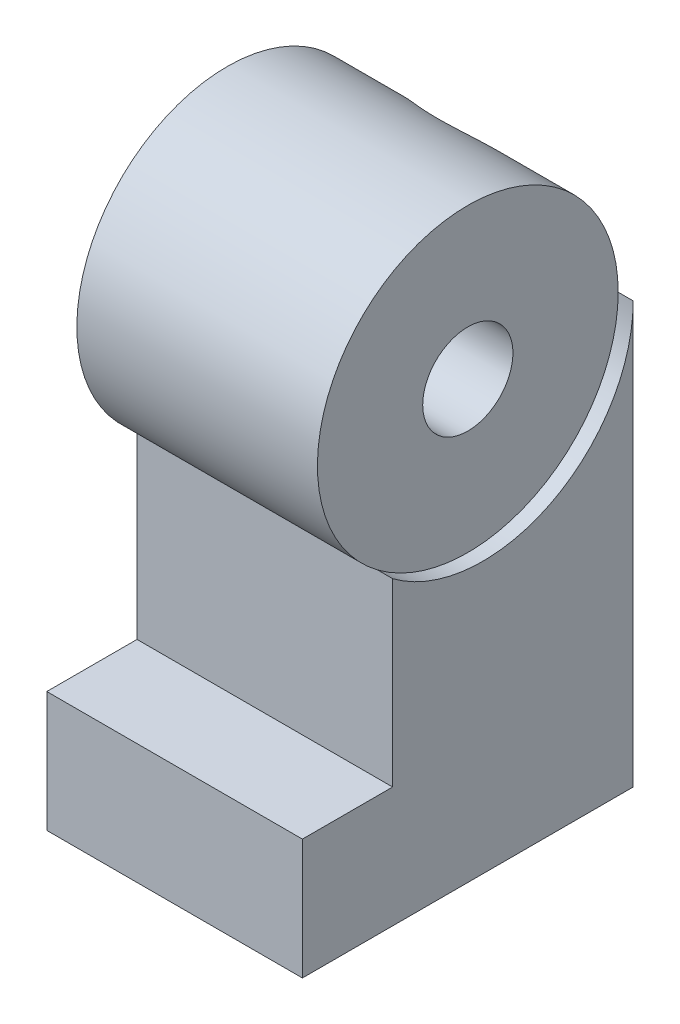
ISO-10303-21;
HEADER;
FILE_DESCRIPTION(('STEP AP214'),'2;1');
FILE_NAME('part.step','',(''),(''),'','','');
FILE_SCHEMA(('AUTOMOTIVE_DESIGN { 1 0 10303 214 1 1 1 1 }'));
ENDSEC;
DATA;
#1=APPLICATION_CONTEXT('core data for automotive mechanical design processes');
#2=APPLICATION_PROTOCOL_DEFINITION('international standard','automotive_design',2000,#1);
#3=PRODUCT_CONTEXT('',#1,'mechanical');
#4=PRODUCT('Part','Part','',(#3));
#5=PRODUCT_RELATED_PRODUCT_CATEGORY('part','',(#4));
#6=PRODUCT_DEFINITION_FORMATION('','',#4);
#7=PRODUCT_DEFINITION_CONTEXT('part definition',#1,'design');
#8=PRODUCT_DEFINITION('design','',#6,#7);
#9=PRODUCT_DEFINITION_SHAPE('','',#8);
#10=(LENGTH_UNIT() NAMED_UNIT(*) SI_UNIT(.MILLI.,.METRE.));
#11=(NAMED_UNIT(*) PLANE_ANGLE_UNIT() SI_UNIT($,.RADIAN.));
#12=(NAMED_UNIT(*) SI_UNIT($,.STERADIAN.) SOLID_ANGLE_UNIT());
#13=UNCERTAINTY_MEASURE_WITH_UNIT(LENGTH_MEASURE(1.E-05),#10,'distance_accuracy_value','');
#14=(GEOMETRIC_REPRESENTATION_CONTEXT(3) GLOBAL_UNCERTAINTY_ASSIGNED_CONTEXT((#13)) GLOBAL_UNIT_ASSIGNED_CONTEXT((#10,
#11,#12)) REPRESENTATION_CONTEXT('',''));
#15=CARTESIAN_POINT('',(0.,0.,0.));
#16=DIRECTION('',(0.,0.,1.));
#17=DIRECTION('',(1.,0.,0.));
#18=AXIS2_PLACEMENT_3D('',#15,#16,#17);
#19=CARTESIAN_POINT('',(6.746875,0.,4.365625));
#20=DIRECTION('',(0.,1.,0.));
#21=DIRECTION('',(0.,0.,1.));
#22=AXIS2_PLACEMENT_3D('',#19,#20,#21);
#23=PLANE('',#22);
#24=DIRECTION('',(-1.,0.,0.));
#25=VECTOR('',#24,1.);
#26=CARTESIAN_POINT('',(6.746875,0.,-4.365625));
#27=LINE('',#26,#25);
#28=CARTESIAN_POINT('',(0.,0.,-4.365625));
#29=VERTEX_POINT('',#28);
#30=CARTESIAN_POINT('',(-6.746875,0.,-4.365625));
#31=VERTEX_POINT('',#30);
#32=EDGE_CURVE('E174',#29,#31,#27,.T.);
#33=ORIENTED_EDGE('',*,*,#32,.F.);
#34=DIRECTION('',(0.,0.,-1.));
#35=VECTOR('',#34,1.);
#36=CARTESIAN_POINT('',(0.,0.,4.365625));
#37=LINE('',#36,#35);
#38=CARTESIAN_POINT('',(0.,0.,4.365625));
#39=VERTEX_POINT('',#38);
#40=EDGE_CURVE('E162',#39,#29,#37,.T.);
#41=ORIENTED_EDGE('',*,*,#40,.F.);
#42=DIRECTION('',(-1.,0.,0.));
#43=VECTOR('',#42,1.);
#44=CARTESIAN_POINT('',(6.746875,0.,4.365625));
#45=LINE('',#44,#43);
#46=CARTESIAN_POINT('',(-6.746875,0.,4.365625));
#47=VERTEX_POINT('',#46);
#48=EDGE_CURVE('E49',#39,#47,#45,.T.);
#49=ORIENTED_EDGE('',*,*,#48,.T.);
#50=DIRECTION('',(0.,0.,-1.));
#51=VECTOR('',#50,1.);
#52=CARTESIAN_POINT('',(-6.746875,0.,4.365625));
#53=LINE('',#52,#51);
#54=EDGE_CURVE('E220',#47,#31,#53,.T.);
#55=ORIENTED_EDGE('',*,*,#54,.T.);
#56=EDGE_LOOP('',(#33,#41,#49,#55));
#57=FACE_BOUND('',#56,.T.);
#58=DIRECTION('',(-1.,0.,0.));
#59=VECTOR('',#58,1.);
#60=CARTESIAN_POINT('',(-5.953125,0.,2.38125));
#61=LINE('',#60,#59);
#62=CARTESIAN_POINT('',(-1.190625,0.,2.38125));
#63=VERTEX_POINT('',#62);
#64=CARTESIAN_POINT('',(-5.953125,0.,2.38125));
#65=VERTEX_POINT('',#64);
#66=EDGE_CURVE('E282',#63,#65,#61,.T.);
#67=ORIENTED_EDGE('',*,*,#66,.F.);
#68=DIRECTION('',(0.,0.,1.));
#69=VECTOR('',#68,1.);
#70=CARTESIAN_POINT('',(-1.190625,0.,2.38125));
#71=LINE('',#70,#69);
#72=CARTESIAN_POINT('',(-1.190625,0.,-2.38125));
#73=VERTEX_POINT('',#72);
#74=EDGE_CURVE('E278',#73,#63,#71,.T.);
#75=ORIENTED_EDGE('',*,*,#74,.F.);
#76=DIRECTION('',(1.,0.,0.));
#77=VECTOR('',#76,1.);
#78=CARTESIAN_POINT('',(-1.190625,0.,-2.38125));
#79=LINE('',#78,#77);
#80=CARTESIAN_POINT('',(-5.953125,0.,-2.38125));
#81=VERTEX_POINT('',#80);
#82=EDGE_CURVE('E239',#81,#73,#79,.T.);
#83=ORIENTED_EDGE('',*,*,#82,.F.);
#84=DIRECTION('',(0.,0.,-1.));
#85=VECTOR('',#84,1.);
#86=CARTESIAN_POINT('',(-5.953125,0.,0.));
#87=LINE('',#86,#85);
#88=EDGE_CURVE('E234',#65,#81,#87,.T.);
#89=ORIENTED_EDGE('',*,*,#88,.F.);
#90=EDGE_LOOP('',(#67,#75,#83,#89));
#91=FACE_BOUND('',#90,.T.);
#92=ADVANCED_FACE('F41',(#57,#91),#23,.F.);
#93=CARTESIAN_POINT('',(6.746875,0.,4.365625));
#94=DIRECTION('',(0.,0.,-1.));
#95=DIRECTION('',(-1.,0.,0.));
#96=AXIS2_PLACEMENT_3D('',#93,#94,#95);
#97=PLANE('',#96);
#98=ORIENTED_EDGE('',*,*,#48,.F.);
#99=DIRECTION('',(0.,-1.,0.));
#100=VECTOR('',#99,1.);
#101=CARTESIAN_POINT('',(0.,0.,4.365625));
#102=LINE('',#101,#100);
#103=CARTESIAN_POINT('',(0.,3.175,4.365625));
#104=VERTEX_POINT('',#103);
#105=EDGE_CURVE('E159',#104,#39,#102,.T.);
#106=ORIENTED_EDGE('',*,*,#105,.F.);
#107=DIRECTION('',(-1.,0.,0.));
#108=VECTOR('',#107,1.);
#109=CARTESIAN_POINT('',(6.746875,3.175,4.365625));
#110=LINE('',#109,#108);
#111=CARTESIAN_POINT('',(-6.746875,3.175,4.365625));
#112=VERTEX_POINT('',#111);
#113=EDGE_CURVE('E191',#104,#112,#110,.T.);
#114=ORIENTED_EDGE('',*,*,#113,.T.);
#115=DIRECTION('',(0.,-1.,0.));
#116=VECTOR('',#115,1.);
#117=CARTESIAN_POINT('',(-6.746875,0.,4.365625));
#118=LINE('',#117,#116);
#119=EDGE_CURVE('E178',#112,#47,#118,.T.);
#120=ORIENTED_EDGE('',*,*,#119,.T.);
#121=EDGE_LOOP('',(#98,#106,#114,#120));
#122=FACE_BOUND('',#121,.T.);
#123=ADVANCED_FACE('F43',(#122),#97,.F.);
#124=CARTESIAN_POINT('',(6.746875,11.1125,-4.365625));
#125=DIRECTION('',(0.,0.,1.));
#126=DIRECTION('',(0.,-1.,0.));
#127=AXIS2_PLACEMENT_3D('',#124,#125,#126);
#128=PLANE('',#127);
#129=DIRECTION('',(-1.,0.,0.));
#130=VECTOR('',#129,1.);
#131=CARTESIAN_POINT('',(6.746875,11.1125,-4.365625));
#132=LINE('',#131,#130);
#133=CARTESIAN_POINT('',(0.,11.1125,-4.365625));
#134=VERTEX_POINT('',#133);
#135=CARTESIAN_POINT('',(-0.396874999999998,11.1125,-4.365625));
#136=VERTEX_POINT('',#135);
#137=EDGE_CURVE('E183',#134,#136,#132,.T.);
#138=ORIENTED_EDGE('',*,*,#137,.F.);
#139=DIRECTION('',(0.,-1.,0.));
#140=VECTOR('',#139,1.);
#141=CARTESIAN_POINT('',(0.,11.1125,-4.365625));
#142=LINE('',#141,#140);
#143=EDGE_CURVE('E56',#134,#29,#142,.T.);
#144=ORIENTED_EDGE('',*,*,#143,.T.);
#145=ORIENTED_EDGE('',*,*,#32,.T.);
#146=DIRECTION('',(0.,1.,0.));
#147=VECTOR('',#146,1.);
#148=CARTESIAN_POINT('',(-6.746875,11.1125,-4.365625));
#149=LINE('',#148,#147);
#150=CARTESIAN_POINT('',(-6.746875,11.1125,-4.365625));
#151=VERTEX_POINT('',#150);
#152=EDGE_CURVE('E217',#31,#151,#149,.T.);
#153=ORIENTED_EDGE('',*,*,#152,.T.);
#154=DIRECTION('',(1.,0.,0.));
#155=VECTOR('',#154,1.);
#156=CARTESIAN_POINT('',(-6.746875,11.1125,-4.365625));
#157=LINE('',#156,#155);
#158=CARTESIAN_POINT('',(-5.81693903026729,11.1125,-4.365625));
#159=VERTEX_POINT('',#158);
#160=EDGE_CURVE('E204',#151,#159,#157,.T.);
#161=ORIENTED_EDGE('',*,*,#160,.T.);
#162=CARTESIAN_POINT('',(-3.571875,11.90625,-4.365625));
#163=DIRECTION('',(0.,0.,1.));
#164=DIRECTION('',(0.,1.,0.));
#165=AXIS2_PLACEMENT_3D('',#162,#163,#164);
#166=CIRCLE('',#165,2.38125000000001);
#167=CARTESIAN_POINT('',(-1.32681096973271,11.1125,-4.365625));
#168=VERTEX_POINT('',#167);
#169=EDGE_CURVE('E656',#159,#168,#166,.T.);
#170=ORIENTED_EDGE('',*,*,#169,.T.);
#171=EDGE_CURVE('E208',#168,#136,#157,.T.);
#172=ORIENTED_EDGE('',*,*,#171,.T.);
#173=EDGE_LOOP('',(#138,#144,#145,#153,#161,#170,#172));
#174=FACE_BOUND('',#173,.T.);
#175=CARTESIAN_POINT('',(-3.571875,3.96875,-4.365625));
#176=DIRECTION('',(0.,0.,1.));
#177=DIRECTION('',(0.,1.,0.));
#178=AXIS2_PLACEMENT_3D('',#175,#176,#177);
#179=CIRCLE('',#178,2.38125);
#180=CARTESIAN_POINT('',(-3.571875,6.35,-4.365625));
#181=VERTEX_POINT('',#180);
#182=EDGE_CURVE('E659',#181,#181,#179,.T.);
#183=ORIENTED_EDGE('',*,*,#182,.T.);
#184=EDGE_LOOP('',(#183));
#185=FACE_BOUND('',#184,.T.);
#186=ADVANCED_FACE('F349',(#174,#185),#128,.F.);
#187=CARTESIAN_POINT('',(6.746875,3.175,1.984375));
#188=DIRECTION('',(0.,0.,-1.));
#189=DIRECTION('',(-1.,0.,0.));
#190=AXIS2_PLACEMENT_3D('',#187,#188,#189);
#191=PLANE('',#190);
#192=DIRECTION('',(-1.,0.,0.));
#193=VECTOR('',#192,1.);
#194=CARTESIAN_POINT('',(6.746875,3.175,1.984375));
#195=LINE('',#194,#193);
#196=CARTESIAN_POINT('',(0.,3.175,1.984375));
#197=VERTEX_POINT('',#196);
#198=CARTESIAN_POINT('',(-6.746875,3.175,1.984375));
#199=VERTEX_POINT('',#198);
#200=EDGE_CURVE('E188',#197,#199,#195,.T.);
#201=ORIENTED_EDGE('',*,*,#200,.F.);
#202=DIRECTION('',(0.,1.,0.));
#203=VECTOR('',#202,1.);
#204=CARTESIAN_POINT('',(0.,3.175,1.984375));
#205=LINE('',#204,#203);
#206=CARTESIAN_POINT('',(0.,7.9375,1.984375));
#207=VERTEX_POINT('',#206);
#208=EDGE_CURVE('E175',#197,#207,#205,.T.);
#209=ORIENTED_EDGE('',*,*,#208,.T.);
#210=DIRECTION('',(1.,0.,0.));
#211=VECTOR('',#210,1.);
#212=CARTESIAN_POINT('',(-11.2253201513364,7.9375,1.984375));
#213=LINE('',#212,#211);
#214=CARTESIAN_POINT('',(-0.396875,7.9375,1.984375));
#215=VERTEX_POINT('',#214);
#216=EDGE_CURVE('E194',#207,#215,#213,.F.);
#217=ORIENTED_EDGE('',*,*,#216,.T.);
#218=DIRECTION('',(-1.,0.,0.));
#219=VECTOR('',#218,1.);
#220=CARTESIAN_POINT('',(11.2253201513364,7.9375,1.984375));
#221=LINE('',#220,#219);
#222=CARTESIAN_POINT('',(-6.746875,7.9375,1.984375));
#223=VERTEX_POINT('',#222);
#224=EDGE_CURVE('E225',#223,#215,#221,.F.);
#225=ORIENTED_EDGE('',*,*,#224,.F.);
#226=DIRECTION('',(0.,-1.,0.));
#227=VECTOR('',#226,1.);
#228=CARTESIAN_POINT('',(-6.746875,3.175,1.984375));
#229=LINE('',#228,#227);
#230=EDGE_CURVE('E213',#223,#199,#229,.T.);
#231=ORIENTED_EDGE('',*,*,#230,.T.);
#232=EDGE_LOOP('',(#201,#209,#217,#225,#231));
#233=FACE_BOUND('',#232,.T.);
#234=ADVANCED_FACE('F345',(#233),#191,.F.);
#235=CARTESIAN_POINT('',(6.746875,3.175,4.365625));
#236=DIRECTION('',(0.,-1.,0.));
#237=DIRECTION('',(0.,0.,-1.));
#238=AXIS2_PLACEMENT_3D('',#235,#236,#237);
#239=PLANE('',#238);
#240=ORIENTED_EDGE('',*,*,#113,.F.);
#241=DIRECTION('',(0.,0.,-1.));
#242=VECTOR('',#241,1.);
#243=CARTESIAN_POINT('',(0.,3.175,4.365625));
#244=LINE('',#243,#242);
#245=EDGE_CURVE('E164',#104,#197,#244,.T.);
#246=ORIENTED_EDGE('',*,*,#245,.T.);
#247=ORIENTED_EDGE('',*,*,#200,.T.);
#248=DIRECTION('',(0.,0.,1.));
#249=VECTOR('',#248,1.);
#250=CARTESIAN_POINT('',(-6.746875,3.175,4.365625));
#251=LINE('',#250,#249);
#252=EDGE_CURVE('E209',#199,#112,#251,.T.);
#253=ORIENTED_EDGE('',*,*,#252,.T.);
#254=EDGE_LOOP('',(#240,#246,#247,#253));
#255=FACE_BOUND('',#254,.T.);
#256=ADVANCED_FACE('F341',(#255),#239,.F.);
#257=CARTESIAN_POINT('',(17.9721951513364,11.1125,-0.396874999999999));
#258=DIRECTION('',(-1.,0.,0.));
#259=DIRECTION('',(0.,0.,1.));
#260=AXIS2_PLACEMENT_3D('',#257,#258,#259);
#261=CYLINDRICAL_SURFACE('',#260,3.96875);
#262=ORIENTED_EDGE('',*,*,#216,.F.);
#263=CARTESIAN_POINT('',(0.,11.1125,-0.396874999999999));
#264=DIRECTION('',(-1.,0.,0.));
#265=DIRECTION('',(0.,0.,1.));
#266=AXIS2_PLACEMENT_3D('',#263,#264,#265);
#267=CIRCLE('',#266,3.96875);
#268=EDGE_CURVE('E12',#207,#134,#267,.F.);
#269=ORIENTED_EDGE('',*,*,#268,.T.);
#270=ORIENTED_EDGE('',*,*,#137,.T.);
#271=CARTESIAN_POINT('',(-0.396874999999998,11.1125,-0.396874999999999));
#272=DIRECTION('',(-1.,0.,0.));
#273=DIRECTION('',(0.,0.,1.));
#274=AXIS2_PLACEMENT_3D('',#271,#272,#273);
#275=CIRCLE('',#274,3.96875);
#276=EDGE_CURVE('E255',#215,#136,#275,.F.);
#277=ORIENTED_EDGE('',*,*,#276,.F.);
#278=EDGE_LOOP('',(#262,#269,#270,#277));
#279=FACE_BOUND('',#278,.T.);
#280=ADVANCED_FACE('F337',(#279),#261,.F.);
#281=CARTESIAN_POINT('',(-1.190625,15.08325,-2.38125));
#282=DIRECTION('',(0.,0.,1.));
#283=DIRECTION('',(0.,-1.,0.));
#284=AXIS2_PLACEMENT_3D('',#281,#282,#283);
#285=PLANE('',#284);
#286=DIRECTION('',(0.,1.,0.));
#287=VECTOR('',#286,1.);
#288=CARTESIAN_POINT('',(-2.778125,9.66118596973271,-2.38125));
#289=LINE('',#288,#287);
#290=CARTESIAN_POINT('',(-2.778125,9.66118596973271,-2.38125));
#291=VERTEX_POINT('',#290);
#292=CARTESIAN_POINT('',(-2.778125,14.1513140302673,-2.38125));
#293=VERTEX_POINT('',#292);
#294=EDGE_CURVE('E640',#291,#293,#289,.T.);
#295=ORIENTED_EDGE('',*,*,#294,.T.);
#296=CARTESIAN_POINT('',(-3.571875,11.90625,-2.38125));
#297=DIRECTION('',(0.,0.,-1.));
#298=DIRECTION('',(0.,-1.,0.));
#299=AXIS2_PLACEMENT_3D('',#296,#297,#298);
#300=CIRCLE('',#299,2.38125000000001);
#301=EDGE_CURVE('E317',#291,#293,#300,.F.);
#302=ORIENTED_EDGE('',*,*,#301,.F.);
#303=EDGE_LOOP('',(#295,#302));
#304=FACE_BOUND('',#303,.T.);
#305=ADVANCED_FACE('F340',(#304),#285,.F.);
#306=CARTESIAN_POINT('',(-1.190625,15.08325,-2.38125));
#307=DIRECTION('',(0.,0.,1.));
#308=DIRECTION('',(0.,-1.,0.));
#309=AXIS2_PLACEMENT_3D('',#306,#307,#308);
#310=PLANE('',#309);
#311=CARTESIAN_POINT('',(-3.571875,3.96875,-2.38125));
#312=DIRECTION('',(0.,0.,-1.));
#313=DIRECTION('',(0.,-1.,0.));
#314=AXIS2_PLACEMENT_3D('',#311,#312,#313);
#315=CIRCLE('',#314,2.38125);
#316=CARTESIAN_POINT('',(-1.190625,3.96875,-2.38125));
#317=VERTEX_POINT('',#316);
#318=CARTESIAN_POINT('',(-5.953125,3.96875,-2.38125));
#319=VERTEX_POINT('',#318);
#320=EDGE_CURVE('E316',#317,#319,#315,.F.);
#321=ORIENTED_EDGE('',*,*,#320,.F.);
#322=DIRECTION('',(0.,-1.,0.));
#323=VECTOR('',#322,1.);
#324=CARTESIAN_POINT('',(-1.190625,15.08325,-2.38125));
#325=LINE('',#324,#323);
#326=CARTESIAN_POINT('',(-1.190625,7.67546167873051,-2.38125));
#327=VERTEX_POINT('',#326);
#328=EDGE_CURVE('E267',#327,#317,#325,.T.);
#329=ORIENTED_EDGE('',*,*,#328,.F.);
#330=DIRECTION('',(-1.,0.,0.));
#331=VECTOR('',#330,1.);
#332=CARTESIAN_POINT('',(10.8284451513364,7.67546167873051,-2.38125));
#333=LINE('',#332,#331);
#334=CARTESIAN_POINT('',(-5.953125,7.67546167873051,-2.38125));
#335=VERTEX_POINT('',#334);
#336=EDGE_CURVE('E302',#327,#335,#333,.T.);
#337=ORIENTED_EDGE('',*,*,#336,.T.);
#338=DIRECTION('',(0.,-1.,0.));
#339=VECTOR('',#338,1.);
#340=CARTESIAN_POINT('',(-5.953125,15.08325,-2.38125));
#341=LINE('',#340,#339);
#342=EDGE_CURVE('E274',#335,#319,#341,.T.);
#343=ORIENTED_EDGE('',*,*,#342,.T.);
#344=EDGE_LOOP('',(#321,#329,#337,#343));
#345=FACE_BOUND('',#344,.T.);
#346=ADVANCED_FACE('F329',(#345),#310,.T.);
#347=CARTESIAN_POINT('',(11.2253201513364,11.1125,-0.396874999999999));
#348=DIRECTION('',(-1.,0.,0.));
#349=DIRECTION('',(0.,0.,-1.));
#350=AXIS2_PLACEMENT_3D('',#347,#348,#349);
#351=CYLINDRICAL_SURFACE('',#350,3.96875);
#352=CARTESIAN_POINT('',(-1.32681096973271,11.1125,-4.365625));
#353=CARTESIAN_POINT('',(-1.30701755525374,11.1684542487782,-4.36563495142378));
#354=CARTESIAN_POINT('',(-1.28933418573402,11.2251567426196,-4.36444187589844));
#355=CARTESIAN_POINT('',(-1.25826719656662,11.339615668586,-4.35953264570903));
#356=CARTESIAN_POINT('',(-1.2448832691343,11.3973720249551,-4.3558166717113));
#357=CARTESIAN_POINT('',(-1.22253803103019,11.5132653525563,-4.34576537472123));
#358=CARTESIAN_POINT('',(-1.21355875029495,11.5713997800275,-4.33944089181621));
#359=CARTESIAN_POINT('',(-1.19994008150046,11.68780993877,-4.32414497095028));
#360=CARTESIAN_POINT('',(-1.19530050429691,11.7460856637718,-4.31517364837326));
#361=CARTESIAN_POINT('',(-1.18783402252553,11.9205011039694,-4.28428932674348));
#362=CARTESIAN_POINT('',(-1.19144682230573,12.0362954200456,-4.25840032621934));
#363=CARTESIAN_POINT('',(-1.21480133281904,12.2635264169128,-4.19687828490391));
#364=CARTESIAN_POINT('',(-1.23455316803175,12.3749603162937,-4.1612391369035));
#365=CARTESIAN_POINT('',(-1.28945780546674,12.594878206545,-4.08031480120449));
#366=CARTESIAN_POINT('',(-1.32512164870348,12.7031253464996,-4.03473759885851));
#367=CARTESIAN_POINT('',(-1.40995842608976,12.910772929603,-3.93670525741914));
#368=CARTESIAN_POINT('',(-1.45913444185718,13.0101713478367,-3.884248550798));
#369=CARTESIAN_POINT('',(-1.57850828121833,13.2151339018736,-3.76528729185824));
#370=CARTESIAN_POINT('',(-1.65084913136497,13.3189326446407,-3.69790269036965));
#371=CARTESIAN_POINT('',(-1.8097757049671,13.5128380361569,-3.55971381274583));
#372=CARTESIAN_POINT('',(-1.89639328803208,13.6029131743021,-3.48890214433307));
#373=CARTESIAN_POINT('',(-2.04503270465009,13.7350768823537,-3.37635143782159));
#374=CARTESIAN_POINT('',(-2.1028373332676,13.7818412968881,-3.33443489445976));
#375=CARTESIAN_POINT('',(-2.22314076494899,13.8701336363607,-3.25171092436964));
#376=CARTESIAN_POINT('',(-2.28564167761434,13.911659185256,-3.2109040074379));
#377=CARTESIAN_POINT('',(-2.41522685178416,13.98908449684,-3.13170532815867));
#378=CARTESIAN_POINT('',(-2.48229935284518,14.0249979664163,-3.09330782298671));
#379=CARTESIAN_POINT('',(-2.62123402300634,14.0908637875129,-3.02037206915601));
#380=CARTESIAN_POINT('',(-2.69309124281277,14.1208221748982,-2.98582992857089));
#381=CARTESIAN_POINT('',(-2.8475670512362,14.1762671053601,-2.9200281156823));
#382=CARTESIAN_POINT('',(-2.93058753935312,14.2012168561875,-2.88924005750429));
#383=CARTESIAN_POINT('',(-3.10166067161263,14.2422625358819,-2.83750297370962));
#384=CARTESIAN_POINT('',(-3.18970215569316,14.2583773156041,-2.8165330136554));
#385=CARTESIAN_POINT('',(-3.37018005290364,14.2806970263171,-2.78724525807482));
#386=CARTESIAN_POINT('',(-3.46265288221283,14.2867962238212,-2.77906249883042));
#387=CARTESIAN_POINT('',(-3.64782240088153,14.2880875326372,-2.77734248857693));
#388=CARTESIAN_POINT('',(-3.74051907887779,14.283280186437,-2.78380450914133));
#389=CARTESIAN_POINT('',(-3.9119398229629,14.2644843582118,-2.80854588253211));
#390=CARTESIAN_POINT('',(-3.99102190241361,14.2516462481256,-2.82534073482566));
#391=CARTESIAN_POINT('',(-4.14536649071659,14.2187583541195,-2.86726909307836));
#392=CARTESIAN_POINT('',(-4.22062549115162,14.1987020778502,-2.89241010437086));
#393=CARTESIAN_POINT('',(-4.41491912867954,14.1369086837694,-2.96739228283316));
#394=CARTESIAN_POINT('',(-4.53009220373622,14.089596197385,-3.02258860505556));
#395=CARTESIAN_POINT('',(-4.7484218209142,13.9801551686941,-3.14170959287202));
#396=CARTESIAN_POINT('',(-4.85153633106603,13.9179769750056,-3.20566319517299));
#397=CARTESIAN_POINT('',(-5.01113575176531,13.8048570233376,-3.3133696473234));
#398=CARTESIAN_POINT('',(-5.07110844847499,13.7578494344151,-3.35616718956509));
#399=CARTESIAN_POINT('',(-5.18615961786883,13.6584557082274,-3.44210253914183));
#400=CARTESIAN_POINT('',(-5.24123664209993,13.6060679889914,-3.48524044309471));
#401=CARTESIAN_POINT('',(-5.3987969941357,13.4411122764214,-3.61368535655438));
#402=CARTESIAN_POINT('',(-5.49387346962105,13.3205644315129,-3.69820896743568));
#403=CARTESIAN_POINT('',(-5.64558468177028,13.0835635829583,-3.84384143135618));
#404=CARTESIAN_POINT('',(-5.70607404999784,12.9704414438622,-3.90639638612007));
#405=CARTESIAN_POINT('',(-5.809146855791,12.7319391129767,-4.02259929427164));
#406=CARTESIAN_POINT('',(-5.85174641472338,12.6065700835947,-4.0762552404816));
#407=CARTESIAN_POINT('',(-5.9000444298798,12.4108054268426,-4.14791656174465));
#408=CARTESIAN_POINT('',(-5.91357250663917,12.3438963897962,-4.17042700331695));
#409=CARTESIAN_POINT('',(-5.93490653945093,12.2081513519553,-4.21204852034721));
#410=CARTESIAN_POINT('',(-5.9427157240873,12.1393164612206,-4.23116150920455));
#411=CARTESIAN_POINT('',(-5.9522831482818,12.0003538391527,-4.26570110143064));
#412=CARTESIAN_POINT('',(-5.95404522641276,11.9302269563855,-4.28113003756639));
#413=CARTESIAN_POINT('',(-5.9512989945741,11.7893928936788,-4.30813263003261));
#414=CARTESIAN_POINT('',(-5.94679319797398,11.7186859576363,-4.31970782937556));
#415=CARTESIAN_POINT('',(-5.92919483451744,11.5574140038843,-4.34166513075442));
#416=CARTESIAN_POINT('',(-5.91403523758213,11.4668847895153,-4.35078531060102));
#417=CARTESIAN_POINT('',(-5.88345670776998,11.3326119670545,-4.35977224461627));
#418=CARTESIAN_POINT('',(-5.87194857599804,11.2880830053145,-4.36198558791466));
#419=CARTESIAN_POINT('',(-5.84636132242703,11.1997253376775,-4.36491246473769));
#420=CARTESIAN_POINT('',(-5.83228251038636,11.1558965481034,-4.36562617883319));
#421=CARTESIAN_POINT('',(-5.81693903026729,11.1125,-4.365625));
#422=B_SPLINE_CURVE_WITH_KNOTS('',3,(#352,#353,#354,#355,#356,#357,#358,#359,#360,#361,#362,
#363,#364,#365,#366,#367,#368,#369,#370,#371,#372,#373,#374,#375,#376,#377,#378,#379,#380,#381,
#382,#383,#384,#385,#386,#387,#388,#389,#390,#391,#392,#393,#394,#395,#396,#397,#398,#399,#400,
#401,#402,#403,#404,#405,#406,#407,#408,#409,#410,#411,#412,#413,#414,#415,#416,#417,#418,#419,
#420,#421),.UNSPECIFIED.,.F.,.F.,(4,2,2,2,2,2,2,2,2,2,2,2,2,2,2,2,2,2,2,2,2,2,2,2,2,2,2,2,2,2,2,
2,2,2,4),(0.,0.178003936551981,0.355995127474543,0.533253982525169,0.710505111457348,
1.06480679321033,1.4193309093656,1.78616738421233,2.15308759018841,2.58159393935689,
3.01106981153157,3.2668813061563,3.52280840797637,3.77810032248523,4.03313214757179,
4.30821568372511,4.58270997704483,4.86008387357856,5.13744397392907,5.38207395783397,
5.62692452531978,6.03324709638796,6.44094622281295,6.70283852114437,6.96480804783826,
7.48764136400289,7.91423378942165,8.3404409626894,8.55579968810129,8.77103673944507,
8.98613713765132,9.20115130711372,9.47693752858245,9.614987519328,9.75302088647394),.UNSPECIFIED.);
#423=EDGE_CURVE('E306',#168,#159,#422,.T.);
#424=ORIENTED_EDGE('',*,*,#423,.T.);
#425=ORIENTED_EDGE('',*,*,#160,.F.);
#426=CARTESIAN_POINT('',(-6.746875,11.1125,-0.396874999999999));
#427=DIRECTION('',(1.,0.,0.));
#428=DIRECTION('',(0.,0.,-1.));
#429=AXIS2_PLACEMENT_3D('',#426,#427,#428);
#430=CIRCLE('',#429,3.96875);
#431=EDGE_CURVE('E229',#151,#223,#430,.T.);
#432=ORIENTED_EDGE('',*,*,#431,.T.);
#433=ORIENTED_EDGE('',*,*,#224,.T.);
#434=CARTESIAN_POINT('',(-0.396875,11.1125,-0.396874999999999));
#435=DIRECTION('',(-1.,0.,0.));
#436=DIRECTION('',(0.,0.,1.));
#437=AXIS2_PLACEMENT_3D('',#434,#435,#436);
#438=CIRCLE('',#437,3.96875);
#439=EDGE_CURVE('E200',#136,#215,#438,.F.);
#440=ORIENTED_EDGE('',*,*,#439,.F.);
#441=ORIENTED_EDGE('',*,*,#171,.F.);
#442=EDGE_LOOP('',(#424,#425,#432,#433,#440,#441));
#443=FACE_BOUND('',#442,.T.);
#444=ADVANCED_FACE('F323',(#443),#351,.T.);
#445=CARTESIAN_POINT('',(-6.746875,0.,0.));
#446=DIRECTION('',(1.,0.,0.));
#447=DIRECTION('',(0.,0.,1.));
#448=AXIS2_PLACEMENT_3D('',#445,#446,#447);
#449=PLANE('',#448);
#450=ORIENTED_EDGE('',*,*,#152,.F.);
#451=ORIENTED_EDGE('',*,*,#54,.F.);
#452=ORIENTED_EDGE('',*,*,#119,.F.);
#453=ORIENTED_EDGE('',*,*,#252,.F.);
#454=ORIENTED_EDGE('',*,*,#230,.F.);
#455=ORIENTED_EDGE('',*,*,#431,.F.);
#456=EDGE_LOOP('',(#450,#451,#452,#453,#454,#455));
#457=FACE_BOUND('',#456,.T.);
#458=ADVANCED_FACE('F328',(#457),#449,.F.);
#459=CARTESIAN_POINT('',(-6.746875,3.175,1.190625));
#460=DIRECTION('',(0.,0.,-1.));
#461=DIRECTION('',(1.,0.,0.));
#462=AXIS2_PLACEMENT_3D('',#459,#460,#461);
#463=PLANE('',#462);
#464=DIRECTION('',(-1.,0.,0.));
#465=VECTOR('',#464,1.);
#466=CARTESIAN_POINT('',(10.8284451513364,7.4750805421288,1.190625));
#467=LINE('',#466,#465);
#468=CARTESIAN_POINT('',(-5.953125,7.4750805421288,1.190625));
#469=VERTEX_POINT('',#468);
#470=CARTESIAN_POINT('',(-1.190625,7.4750805421288,1.190625));
#471=VERTEX_POINT('',#470);
#472=EDGE_CURVE('E292',#469,#471,#467,.F.);
#473=ORIENTED_EDGE('',*,*,#472,.T.);
#474=DIRECTION('',(0.,1.,0.));
#475=VECTOR('',#474,1.);
#476=CARTESIAN_POINT('',(-1.190625,15.08325,1.190625));
#477=LINE('',#476,#475);
#478=CARTESIAN_POINT('',(-1.190625,2.38125,1.190625));
#479=VERTEX_POINT('',#478);
#480=EDGE_CURVE('E254',#479,#471,#477,.T.);
#481=ORIENTED_EDGE('',*,*,#480,.F.);
#482=DIRECTION('',(1.,0.,0.));
#483=VECTOR('',#482,1.);
#484=CARTESIAN_POINT('',(-6.746875,2.38125,1.190625));
#485=LINE('',#484,#483);
#486=CARTESIAN_POINT('',(-5.953125,2.38125,1.190625));
#487=VERTEX_POINT('',#486);
#488=EDGE_CURVE('E233',#487,#479,#485,.T.);
#489=ORIENTED_EDGE('',*,*,#488,.F.);
#490=DIRECTION('',(0.,-1.,0.));
#491=VECTOR('',#490,1.);
#492=CARTESIAN_POINT('',(-5.953125,0.,1.190625));
#493=LINE('',#492,#491);
#494=EDGE_CURVE('E238',#469,#487,#493,.T.);
#495=ORIENTED_EDGE('',*,*,#494,.F.);
#496=EDGE_LOOP('',(#473,#481,#489,#495));
#497=FACE_BOUND('',#496,.T.);
#498=ADVANCED_FACE('F335',(#497),#463,.T.);
#499=CARTESIAN_POINT('',(-6.746875,2.38125,4.365625));
#500=DIRECTION('',(0.,-1.,0.));
#501=DIRECTION('',(0.,0.,-1.));
#502=AXIS2_PLACEMENT_3D('',#499,#500,#501);
#503=PLANE('',#502);
#504=DIRECTION('',(1.,0.,0.));
#505=VECTOR('',#504,1.);
#506=CARTESIAN_POINT('',(-5.953125,2.38125,2.38125));
#507=LINE('',#506,#505);
#508=CARTESIAN_POINT('',(-5.953125,2.38125,2.38125));
#509=VERTEX_POINT('',#508);
#510=CARTESIAN_POINT('',(-1.190625,2.38125,2.38125));
#511=VERTEX_POINT('',#510);
#512=EDGE_CURVE('E250',#509,#511,#507,.T.);
#513=ORIENTED_EDGE('',*,*,#512,.F.);
#514=DIRECTION('',(0.,0.,1.));
#515=VECTOR('',#514,1.);
#516=CARTESIAN_POINT('',(-5.953125,2.38125,0.));
#517=LINE('',#516,#515);
#518=EDGE_CURVE('E243',#487,#509,#517,.T.);
#519=ORIENTED_EDGE('',*,*,#518,.F.);
#520=ORIENTED_EDGE('',*,*,#488,.T.);
#521=DIRECTION('',(0.,0.,-1.));
#522=VECTOR('',#521,1.);
#523=CARTESIAN_POINT('',(-1.190625,2.38125,2.38125));
#524=LINE('',#523,#522);
#525=EDGE_CURVE('E259',#511,#479,#524,.T.);
#526=ORIENTED_EDGE('',*,*,#525,.F.);
#527=EDGE_LOOP('',(#513,#519,#520,#526));
#528=FACE_BOUND('',#527,.T.);
#529=ADVANCED_FACE('F404',(#528),#503,.T.);
#530=CARTESIAN_POINT('',(-5.953125,0.,0.));
#531=DIRECTION('',(1.,0.,0.));
#532=DIRECTION('',(0.,0.,1.));
#533=AXIS2_PLACEMENT_3D('',#530,#531,#532);
#534=PLANE('',#533);
#535=CARTESIAN_POINT('',(-5.953125,11.1125,-0.396874999999999));
#536=DIRECTION('',(-1.,0.,0.));
#537=DIRECTION('',(0.,0.,1.));
#538=AXIS2_PLACEMENT_3D('',#535,#536,#537);
#539=CIRCLE('',#538,3.96875);
#540=EDGE_CURVE('E296',#335,#469,#539,.T.);
#541=ORIENTED_EDGE('',*,*,#540,.T.);
#542=ORIENTED_EDGE('',*,*,#494,.T.);
#543=ORIENTED_EDGE('',*,*,#518,.T.);
#544=DIRECTION('',(0.,-1.,0.));
#545=VECTOR('',#544,1.);
#546=CARTESIAN_POINT('',(-5.953125,15.08325,2.38125));
#547=LINE('',#546,#545);
#548=EDGE_CURVE('E266',#509,#65,#547,.T.);
#549=ORIENTED_EDGE('',*,*,#548,.T.);
#550=ORIENTED_EDGE('',*,*,#88,.T.);
#551=EDGE_CURVE('E270',#319,#81,#341,.T.);
#552=ORIENTED_EDGE('',*,*,#551,.F.);
#553=ORIENTED_EDGE('',*,*,#342,.F.);
#554=EDGE_LOOP('',(#541,#542,#543,#549,#550,#552,#553));
#555=FACE_BOUND('',#554,.T.);
#556=ADVANCED_FACE('F331',(#555),#534,.T.);
#557=CARTESIAN_POINT('',(-5.953125,15.08325,2.38125));
#558=DIRECTION('',(0.,0.,-1.));
#559=DIRECTION('',(0.,1.,0.));
#560=AXIS2_PLACEMENT_3D('',#557,#558,#559);
#561=PLANE('',#560);
#562=ORIENTED_EDGE('',*,*,#512,.T.);
#563=DIRECTION('',(0.,-1.,0.));
#564=VECTOR('',#563,1.);
#565=CARTESIAN_POINT('',(-1.190625,15.08325,2.38125));
#566=LINE('',#565,#564);
#567=EDGE_CURVE('E263',#511,#63,#566,.T.);
#568=ORIENTED_EDGE('',*,*,#567,.T.);
#569=ORIENTED_EDGE('',*,*,#66,.T.);
#570=ORIENTED_EDGE('',*,*,#548,.F.);
#571=EDGE_LOOP('',(#562,#568,#569,#570));
#572=FACE_BOUND('',#571,.T.);
#573=ADVANCED_FACE('F418',(#572),#561,.T.);
#574=CARTESIAN_POINT('',(-1.190625,15.08325,2.38125));
#575=DIRECTION('',(-1.,0.,0.));
#576=DIRECTION('',(0.,0.,-1.));
#577=AXIS2_PLACEMENT_3D('',#574,#575,#576);
#578=PLANE('',#577);
#579=CARTESIAN_POINT('',(-1.190625,11.1125,-0.396874999999999));
#580=DIRECTION('',(1.,0.,0.));
#581=DIRECTION('',(0.,0.,-1.));
#582=AXIS2_PLACEMENT_3D('',#579,#580,#581);
#583=CIRCLE('',#582,3.96875);
#584=EDGE_CURVE('E299',#471,#327,#583,.T.);
#585=ORIENTED_EDGE('',*,*,#584,.T.);
#586=ORIENTED_EDGE('',*,*,#328,.T.);
#587=EDGE_CURVE('E262',#317,#73,#325,.T.);
#588=ORIENTED_EDGE('',*,*,#587,.T.);
#589=ORIENTED_EDGE('',*,*,#74,.T.);
#590=ORIENTED_EDGE('',*,*,#567,.F.);
#591=ORIENTED_EDGE('',*,*,#525,.T.);
#592=ORIENTED_EDGE('',*,*,#480,.T.);
#593=EDGE_LOOP('',(#585,#586,#588,#589,#590,#591,#592));
#594=FACE_BOUND('',#593,.T.);
#595=ADVANCED_FACE('F425',(#594),#578,.T.);
#596=CARTESIAN_POINT('',(-3.571875,3.96875,-2.38125));
#597=DIRECTION('',(0.,0.,-1.));
#598=DIRECTION('',(0.,-1.,0.));
#599=AXIS2_PLACEMENT_3D('',#596,#597,#598);
#600=CIRCLE('',#599,2.38125);
#601=EDGE_CURVE('E197',#317,#319,#600,.T.);
#602=ORIENTED_EDGE('',*,*,#601,.T.);
#603=ORIENTED_EDGE('',*,*,#551,.T.);
#604=ORIENTED_EDGE('',*,*,#82,.T.);
#605=ORIENTED_EDGE('',*,*,#587,.F.);
#606=EDGE_LOOP('',(#602,#603,#604,#605));
#607=FACE_BOUND('',#606,.T.);
#608=ADVANCED_FACE('F389',(#607),#310,.T.);
#609=CARTESIAN_POINT('',(-0.396875,0.,0.));
#610=DIRECTION('',(1.,0.,0.));
#611=DIRECTION('',(0.,0.,1.));
#612=AXIS2_PLACEMENT_3D('',#609,#610,#611);
#613=PLANE('',#612);
#614=CARTESIAN_POINT('',(-0.396875,11.1125,-0.396874999999999));
#615=DIRECTION('',(-1.,0.,0.));
#616=DIRECTION('',(0.,0.,1.));
#617=AXIS2_PLACEMENT_3D('',#614,#615,#616);
#618=CIRCLE('',#617,1.190625);
#619=CARTESIAN_POINT('',(-0.396875,11.1125,0.793750000000002));
#620=VERTEX_POINT('',#619);
#621=EDGE_CURVE('E635',#620,#620,#618,.T.);
#622=ORIENTED_EDGE('',*,*,#621,.T.);
#623=EDGE_LOOP('',(#622));
#624=FACE_BOUND('',#623,.T.);
#625=ORIENTED_EDGE('',*,*,#276,.T.);
#626=ORIENTED_EDGE('',*,*,#439,.T.);
#627=EDGE_LOOP('',(#625,#626));
#628=FACE_BOUND('',#627,.T.);
#629=ADVANCED_FACE('F440',(#624,#628),#613,.T.);
#630=CARTESIAN_POINT('',(10.8284451513364,11.1125,-0.396874999999999));
#631=DIRECTION('',(-1.,0.,0.));
#632=DIRECTION('',(0.,0.,-1.));
#633=AXIS2_PLACEMENT_3D('',#630,#631,#632);
#634=CYLINDRICAL_SURFACE('',#633,3.96875);
#635=ORIENTED_EDGE('',*,*,#540,.F.);
#636=ORIENTED_EDGE('',*,*,#336,.F.);
#637=ORIENTED_EDGE('',*,*,#584,.F.);
#638=ORIENTED_EDGE('',*,*,#472,.F.);
#639=EDGE_LOOP('',(#635,#636,#637,#638));
#640=FACE_BOUND('',#639,.T.);
#641=ADVANCED_FACE('F447',(#640),#634,.T.);
#642=CARTESIAN_POINT('',(-3.571875,3.96875,4.35394209080188));
#643=DIRECTION('',(0.,0.,-1.));
#644=DIRECTION('',(0.,1.,0.));
#645=AXIS2_PLACEMENT_3D('',#642,#643,#644);
#646=CYLINDRICAL_SURFACE('',#645,2.38125);
#647=ORIENTED_EDGE('',*,*,#182,.F.);
#648=EDGE_LOOP('',(#647));
#649=FACE_BOUND('',#648,.T.);
#650=ORIENTED_EDGE('',*,*,#320,.T.);
#651=ORIENTED_EDGE('',*,*,#601,.F.);
#652=EDGE_LOOP('',(#650,#651));
#653=FACE_BOUND('',#652,.T.);
#654=ADVANCED_FACE('F455',(#649,#653),#646,.F.);
#655=CARTESIAN_POINT('',(-3.571875,11.90625,4.35394209080188));
#656=DIRECTION('',(0.,0.,-1.));
#657=DIRECTION('',(0.,1.,0.));
#658=AXIS2_PLACEMENT_3D('',#655,#656,#657);
#659=CYLINDRICAL_SURFACE('',#658,2.38125000000001);
#660=ORIENTED_EDGE('',*,*,#423,.F.);
#661=ORIENTED_EDGE('',*,*,#169,.F.);
#662=EDGE_LOOP('',(#660,#661));
#663=FACE_BOUND('',#662,.T.);
#664=ORIENTED_EDGE('',*,*,#301,.T.);
#665=DIRECTION('',(0.,0.,-1.));
#666=VECTOR('',#665,1.);
#667=CARTESIAN_POINT('',(-2.778125,14.1513140302673,1.190625));
#668=LINE('',#667,#666);
#669=CARTESIAN_POINT('',(-2.778125,14.1513140302673,1.190625));
#670=VERTEX_POINT('',#669);
#671=EDGE_CURVE('E653',#670,#293,#668,.T.);
#672=ORIENTED_EDGE('',*,*,#671,.F.);
#673=CARTESIAN_POINT('',(-3.571875,11.90625,1.190625));
#674=DIRECTION('',(0.,0.,1.));
#675=DIRECTION('',(0.,-1.,0.));
#676=AXIS2_PLACEMENT_3D('',#673,#674,#675);
#677=CIRCLE('',#676,2.38125);
#678=CARTESIAN_POINT('',(-2.778125,9.66118596973271,1.190625));
#679=VERTEX_POINT('',#678);
#680=EDGE_CURVE('E644',#670,#679,#677,.T.);
#681=ORIENTED_EDGE('',*,*,#680,.T.);
#682=DIRECTION('',(0.,0.,-1.));
#683=VECTOR('',#682,1.);
#684=CARTESIAN_POINT('',(-2.778125,9.66118596973271,1.190625));
#685=LINE('',#684,#683);
#686=EDGE_CURVE('E63',#679,#291,#685,.T.);
#687=ORIENTED_EDGE('',*,*,#686,.T.);
#688=EDGE_LOOP('',(#664,#672,#681,#687));
#689=FACE_BOUND('',#688,.T.);
#690=ADVANCED_FACE('F319',(#663,#689),#659,.F.);
#691=CARTESIAN_POINT('',(-2.778125,9.66118596973271,1.190625));
#692=DIRECTION('',(1.,0.,0.));
#693=DIRECTION('',(0.,0.,1.));
#694=AXIS2_PLACEMENT_3D('',#691,#692,#693);
#695=PLANE('',#694);
#696=CARTESIAN_POINT('',(-2.778125,11.1125,-0.396874999999999));
#697=DIRECTION('',(-1.,0.,0.));
#698=DIRECTION('',(0.,0.,1.));
#699=AXIS2_PLACEMENT_3D('',#696,#697,#698);
#700=CIRCLE('',#699,1.190625);
#701=CARTESIAN_POINT('',(-2.778125,11.1125,0.793750000000002));
#702=VERTEX_POINT('',#701);
#703=EDGE_CURVE('E632',#702,#702,#700,.T.);
#704=ORIENTED_EDGE('',*,*,#703,.F.);
#705=EDGE_LOOP('',(#704));
#706=FACE_BOUND('',#705,.T.);
#707=ORIENTED_EDGE('',*,*,#294,.F.);
#708=ORIENTED_EDGE('',*,*,#686,.F.);
#709=DIRECTION('',(0.,1.,0.));
#710=VECTOR('',#709,1.);
#711=CARTESIAN_POINT('',(-2.778125,9.66118596973271,1.190625));
#712=LINE('',#711,#710);
#713=EDGE_CURVE('E647',#679,#670,#712,.T.);
#714=ORIENTED_EDGE('',*,*,#713,.T.);
#715=ORIENTED_EDGE('',*,*,#671,.T.);
#716=EDGE_LOOP('',(#707,#708,#714,#715));
#717=FACE_BOUND('',#716,.T.);
#718=ADVANCED_FACE('F469',(#706,#717),#695,.F.);
#719=CARTESIAN_POINT('',(-3.571875,11.90625,1.190625));
#720=DIRECTION('',(0.,0.,1.));
#721=DIRECTION('',(0.,-1.,0.));
#722=AXIS2_PLACEMENT_3D('',#719,#720,#721);
#723=PLANE('',#722);
#724=ORIENTED_EDGE('',*,*,#680,.F.);
#725=ORIENTED_EDGE('',*,*,#713,.F.);
#726=EDGE_LOOP('',(#724,#725));
#727=FACE_BOUND('',#726,.T.);
#728=ADVANCED_FACE('F476',(#727),#723,.F.);
#729=CARTESIAN_POINT('',(-2.778125,11.1125,-0.396874999999999));
#730=DIRECTION('',(1.,0.,0.));
#731=DIRECTION('',(0.,0.,1.));
#732=AXIS2_PLACEMENT_3D('',#729,#730,#731);
#733=CYLINDRICAL_SURFACE('',#732,1.190625);
#734=CARTESIAN_POINT('',(-2.778125,11.1125,0.793750000000002));
#735=CARTESIAN_POINT('',(-2.7533203125,11.1125,0.793750000000002));
#736=CARTESIAN_POINT('',(-2.728515625,11.1125,0.793750000000002));
#737=CARTESIAN_POINT('',(-2.67890625,11.1125,0.793750000000002));
#738=CARTESIAN_POINT('',(-2.6541015625,11.1125,0.793750000000002));
#739=CARTESIAN_POINT('',(-2.6044921875,11.1125,0.793750000000002));
#740=CARTESIAN_POINT('',(-2.5796875,11.1125,0.793750000000002));
#741=CARTESIAN_POINT('',(-2.530078125,11.1125,0.793750000000002));
#742=CARTESIAN_POINT('',(-2.5052734375,11.1125,0.793750000000002));
#743=CARTESIAN_POINT('',(-2.4556640625,11.1125,0.793750000000002));
#744=CARTESIAN_POINT('',(-2.430859375,11.1125,0.793750000000002));
#745=CARTESIAN_POINT('',(-2.38125,11.1125,0.793750000000002));
#746=CARTESIAN_POINT('',(-2.3564453125,11.1125,0.793750000000002));
#747=CARTESIAN_POINT('',(-2.3068359375,11.1125,0.793750000000002));
#748=CARTESIAN_POINT('',(-2.28203125,11.1125,0.793750000000002));
#749=CARTESIAN_POINT('',(-2.232421875,11.1125,0.793750000000002));
#750=CARTESIAN_POINT('',(-2.2076171875,11.1125,0.793750000000002));
#751=CARTESIAN_POINT('',(-2.1580078125,11.1125,0.793750000000002));
#752=CARTESIAN_POINT('',(-2.133203125,11.1125,0.793750000000002));
#753=CARTESIAN_POINT('',(-2.08359375,11.1125,0.793750000000002));
#754=CARTESIAN_POINT('',(-2.0587890625,11.1125,0.793750000000002));
#755=CARTESIAN_POINT('',(-2.0091796875,11.1125,0.793750000000002));
#756=CARTESIAN_POINT('',(-1.984375,11.1125,0.793750000000002));
#757=CARTESIAN_POINT('',(-1.934765625,11.1125,0.793750000000002));
#758=CARTESIAN_POINT('',(-1.9099609375,11.1125,0.793750000000002));
#759=CARTESIAN_POINT('',(-1.8603515625,11.1125,0.793750000000002));
#760=CARTESIAN_POINT('',(-1.835546875,11.1125,0.793750000000002));
#761=CARTESIAN_POINT('',(-1.7859375,11.1125,0.793750000000002));
#762=CARTESIAN_POINT('',(-1.7611328125,11.1125,0.793750000000002));
#763=CARTESIAN_POINT('',(-1.7115234375,11.1125,0.793750000000002));
#764=CARTESIAN_POINT('',(-1.68671875,11.1125,0.793750000000002));
#765=CARTESIAN_POINT('',(-1.637109375,11.1125,0.793750000000002));
#766=CARTESIAN_POINT('',(-1.6123046875,11.1125,0.793750000000002));
#767=CARTESIAN_POINT('',(-1.5626953125,11.1125,0.793750000000002));
#768=CARTESIAN_POINT('',(-1.537890625,11.1125,0.793750000000002));
#769=CARTESIAN_POINT('',(-1.48828125,11.1125,0.793750000000002));
#770=CARTESIAN_POINT('',(-1.4634765625,11.1125,0.793750000000002));
#771=CARTESIAN_POINT('',(-1.4138671875,11.1125,0.793750000000002));
#772=CARTESIAN_POINT('',(-1.3890625,11.1125,0.793750000000002));
#773=CARTESIAN_POINT('',(-1.339453125,11.1125,0.793750000000002));
#774=CARTESIAN_POINT('',(-1.3146484375,11.1125,0.793750000000002));
#775=CARTESIAN_POINT('',(-1.2650390625,11.1125,0.793750000000002));
#776=CARTESIAN_POINT('',(-1.240234375,11.1125,0.793750000000002));
#777=CARTESIAN_POINT('',(-1.190625,11.1125,0.793750000000002));
#778=CARTESIAN_POINT('',(-1.1658203125,11.1125,0.793750000000002));
#779=CARTESIAN_POINT('',(-1.1162109375,11.1125,0.793750000000002));
#780=CARTESIAN_POINT('',(-1.09140625,11.1125,0.793750000000002));
#781=CARTESIAN_POINT('',(-1.041796875,11.1125,0.793750000000002));
#782=CARTESIAN_POINT('',(-1.0169921875,11.1125,0.793750000000002));
#783=CARTESIAN_POINT('',(-0.967382812499999,11.1125,0.793750000000002));
#784=CARTESIAN_POINT('',(-0.942578124999999,11.1125,0.793750000000002));
#785=CARTESIAN_POINT('',(-0.892968749999999,11.1125,0.793750000000002));
#786=CARTESIAN_POINT('',(-0.868164062499999,11.1125,0.793750000000002));
#787=CARTESIAN_POINT('',(-0.818554687499999,11.1125,0.793750000000002));
#788=CARTESIAN_POINT('',(-0.79375,11.1125,0.793750000000002));
#789=CARTESIAN_POINT('',(-0.744140625,11.1125,0.793750000000002));
#790=CARTESIAN_POINT('',(-0.7193359375,11.1125,0.793750000000002));
#791=CARTESIAN_POINT('',(-0.6697265625,11.1125,0.793750000000002));
#792=CARTESIAN_POINT('',(-0.644921875,11.1125,0.793750000000002));
#793=CARTESIAN_POINT('',(-0.5953125,11.1125,0.793750000000002));
#794=CARTESIAN_POINT('',(-0.5705078125,11.1125,0.793750000000002));
#795=CARTESIAN_POINT('',(-0.5208984375,11.1125,0.793750000000002));
#796=CARTESIAN_POINT('',(-0.49609375,11.1125,0.793750000000002));
#797=CARTESIAN_POINT('',(-0.446484375,11.1125,0.793750000000002));
#798=CARTESIAN_POINT('',(-0.4216796875,11.1125,0.793750000000002));
#799=CARTESIAN_POINT('',(-0.396875,11.1125,0.793750000000002));
#800=B_SPLINE_CURVE_WITH_KNOTS('',3,(#734,#735,#736,#737,#738,#739,#740,#741,#742,#743,#744,
#745,#746,#747,#748,#749,#750,#751,#752,#753,#754,#755,#756,#757,#758,#759,#760,#761,#762,#763,
#764,#765,#766,#767,#768,#769,#770,#771,#772,#773,#774,#775,#776,#777,#778,#779,#780,#781,#782,
#783,#784,#785,#786,#787,#788,#789,#790,#791,#792,#793,#794,#795,#796,#797,#798,#799),
.UNSPECIFIED.,.F.,.F.,(4,2,2,2,2,2,2,2,2,2,2,2,2,2,2,2,2,2,2,2,2,2,2,2,2,2,2,2,2,2,2,2,4),(0.,
0.0744140625,0.148828125,0.2232421875,0.29765625,0.3720703125,0.446484375,0.5208984375,
0.5953125,0.6697265625,0.744140625,0.8185546875,0.89296875,0.9673828125,1.041796875,
1.1162109375,1.190625,1.2650390625,1.339453125,1.4138671875,1.48828125,1.5626953125,1.637109375,
1.7115234375,1.7859375,1.8603515625,1.934765625,2.0091796875,2.08359375,2.1580078125,
2.232421875,2.3068359375,2.38125),.UNSPECIFIED.);
#801=EDGE_CURVE('BSEAM484',#702,#620,#800,.T.);
#802=ORIENTED_EDGE('',*,*,#703,.T.);
#803=ORIENTED_EDGE('',*,*,#621,.F.);
#804=ORIENTED_EDGE('',*,*,#801,.T.);
#805=ORIENTED_EDGE('',*,*,#801,.F.);
#806=EDGE_LOOP('',(#802,#804,#803,#805));
#807=FACE_BOUND('',#806,.T.);
#808=ADVANCED_FACE('F484',(#807),#733,.F.);
#809=CARTESIAN_POINT('',(0.,0.,0.));
#810=DIRECTION('',(-1.,0.,0.));
#811=DIRECTION('',(0.,0.,1.));
#812=AXIS2_PLACEMENT_3D('',#809,#810,#811);
#813=PLANE('',#812);
#814=ORIENTED_EDGE('',*,*,#105,.T.);
#815=ORIENTED_EDGE('',*,*,#40,.T.);
#816=ORIENTED_EDGE('',*,*,#143,.F.);
#817=ORIENTED_EDGE('',*,*,#268,.F.);
#818=ORIENTED_EDGE('',*,*,#208,.F.);
#819=ORIENTED_EDGE('',*,*,#245,.F.);
#820=EDGE_LOOP('',(#814,#815,#816,#817,#818,#819));
#821=FACE_BOUND('',#820,.T.);
#822=ADVANCED_FACE('F161',(#821),#813,.F.);
#823=CLOSED_SHELL('',(#92,#123,#186,#234,#256,#280,#305,#346,#444,#458,#498,#529,#556,#573,#595,
#608,#629,#641,#654,#690,#718,#728,#808,#822));
#824=MANIFOLD_SOLID_BREP('B2',#823);
#825=ADVANCED_BREP_SHAPE_REPRESENTATION('',(#18,#824),#14);
#826=SHAPE_DEFINITION_REPRESENTATION(#9,#825);
ENDSEC;
END-ISO-10303-21;
